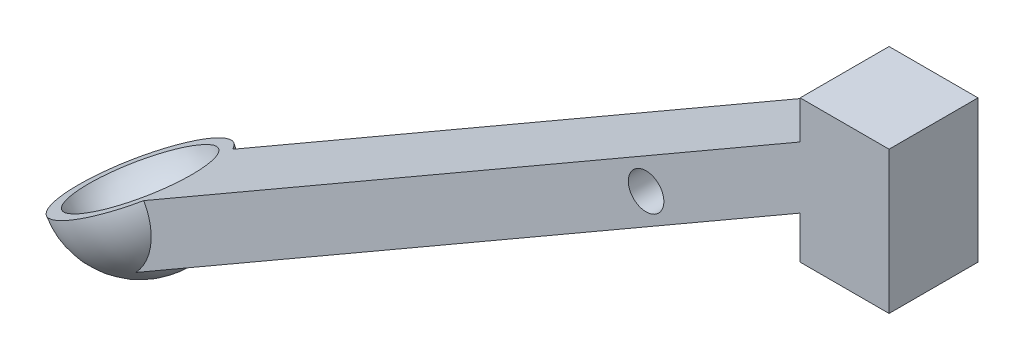
ISO-10303-21;
HEADER;
FILE_DESCRIPTION(('STEP AP214'),'2;1');
FILE_NAME('part.step','',(''),(''),'','','');
FILE_SCHEMA(('AUTOMOTIVE_DESIGN { 1 0 10303 214 1 1 1 1 }'));
ENDSEC;
DATA;
#1=APPLICATION_CONTEXT('core data for automotive mechanical design processes');
#2=APPLICATION_PROTOCOL_DEFINITION('international standard','automotive_design',2000,#1);
#3=PRODUCT_CONTEXT('',#1,'mechanical');
#4=PRODUCT('Part','Part','',(#3));
#5=PRODUCT_RELATED_PRODUCT_CATEGORY('part','',(#4));
#6=PRODUCT_DEFINITION_FORMATION('','',#4);
#7=PRODUCT_DEFINITION_CONTEXT('part definition',#1,'design');
#8=PRODUCT_DEFINITION('design','',#6,#7);
#9=PRODUCT_DEFINITION_SHAPE('','',#8);
#10=(LENGTH_UNIT() NAMED_UNIT(*) SI_UNIT(.MILLI.,.METRE.));
#11=(NAMED_UNIT(*) PLANE_ANGLE_UNIT() SI_UNIT($,.RADIAN.));
#12=(NAMED_UNIT(*) SI_UNIT($,.STERADIAN.) SOLID_ANGLE_UNIT());
#13=UNCERTAINTY_MEASURE_WITH_UNIT(LENGTH_MEASURE(1.E-05),#10,'distance_accuracy_value','');
#14=(GEOMETRIC_REPRESENTATION_CONTEXT(3) GLOBAL_UNCERTAINTY_ASSIGNED_CONTEXT((#13)) GLOBAL_UNIT_ASSIGNED_CONTEXT((#10,
#11,#12)) REPRESENTATION_CONTEXT('',''));
#15=CARTESIAN_POINT('',(0.,0.,0.));
#16=DIRECTION('',(0.,0.,1.));
#17=DIRECTION('',(1.,0.,0.));
#18=AXIS2_PLACEMENT_3D('',#15,#16,#17);
#19=CARTESIAN_POINT('',(25.,-40.,50.));
#20=DIRECTION('',(-1.,0.,0.));
#21=DIRECTION('',(0.,0.,1.));
#22=AXIS2_PLACEMENT_3D('',#19,#20,#21);
#23=PLANE('',#22);
#24=DIRECTION('',(0.,1.,0.));
#25=VECTOR('',#24,1.);
#26=CARTESIAN_POINT('',(25.,-40.,0.));
#27=LINE('',#26,#25);
#28=CARTESIAN_POINT('',(25.,-40.,0.));
#29=VERTEX_POINT('',#28);
#30=CARTESIAN_POINT('',(25.,40.,0.));
#31=VERTEX_POINT('',#30);
#32=EDGE_CURVE('E126',#29,#31,#27,.T.);
#33=ORIENTED_EDGE('',*,*,#32,.T.);
#34=DIRECTION('',(0.,0.,-1.));
#35=VECTOR('',#34,1.);
#36=CARTESIAN_POINT('',(25.,40.,50.));
#37=LINE('',#36,#35);
#38=CARTESIAN_POINT('',(25.,40.,50.));
#39=VERTEX_POINT('',#38);
#40=EDGE_CURVE('E43',#39,#31,#37,.T.);
#41=ORIENTED_EDGE('',*,*,#40,.F.);
#42=DIRECTION('',(0.,1.,0.));
#43=VECTOR('',#42,1.);
#44=CARTESIAN_POINT('',(25.,-40.,50.));
#45=LINE('',#44,#43);
#46=CARTESIAN_POINT('',(25.,-40.,50.));
#47=VERTEX_POINT('',#46);
#48=EDGE_CURVE('E139',#47,#39,#45,.T.);
#49=ORIENTED_EDGE('',*,*,#48,.F.);
#50=DIRECTION('',(0.,0.,-1.));
#51=VECTOR('',#50,1.);
#52=CARTESIAN_POINT('',(25.,-40.,50.));
#53=LINE('',#52,#51);
#54=EDGE_CURVE('E122',#47,#29,#53,.T.);
#55=ORIENTED_EDGE('',*,*,#54,.T.);
#56=EDGE_LOOP('',(#33,#41,#49,#55));
#57=FACE_BOUND('',#56,.T.);
#58=ADVANCED_FACE('F34',(#57),#23,.F.);
#59=CARTESIAN_POINT('',(-25.,40.,50.));
#60=DIRECTION('',(0.,-1.,0.));
#61=DIRECTION('',(0.,0.,-1.));
#62=AXIS2_PLACEMENT_3D('',#59,#60,#61);
#63=PLANE('',#62);
#64=DIRECTION('',(-1.,0.,0.));
#65=VECTOR('',#64,1.);
#66=CARTESIAN_POINT('',(-25.,40.,0.));
#67=LINE('',#66,#65);
#68=CARTESIAN_POINT('',(-25.,40.,0.));
#69=VERTEX_POINT('',#68);
#70=EDGE_CURVE('E129',#31,#69,#67,.T.);
#71=ORIENTED_EDGE('',*,*,#70,.T.);
#72=DIRECTION('',(0.,0.,-1.));
#73=VECTOR('',#72,1.);
#74=CARTESIAN_POINT('',(-25.,40.,50.));
#75=LINE('',#74,#73);
#76=CARTESIAN_POINT('',(-25.,40.,50.));
#77=VERTEX_POINT('',#76);
#78=EDGE_CURVE('E144',#77,#69,#75,.T.);
#79=ORIENTED_EDGE('',*,*,#78,.F.);
#80=DIRECTION('',(-1.,0.,0.));
#81=VECTOR('',#80,1.);
#82=CARTESIAN_POINT('',(-25.,40.,50.));
#83=LINE('',#82,#81);
#84=EDGE_CURVE('E91',#39,#77,#83,.T.);
#85=ORIENTED_EDGE('',*,*,#84,.F.);
#86=ORIENTED_EDGE('',*,*,#40,.T.);
#87=EDGE_LOOP('',(#71,#79,#85,#86));
#88=FACE_BOUND('',#87,.T.);
#89=ADVANCED_FACE('F204',(#88),#63,.F.);
#90=CARTESIAN_POINT('',(-25.,18.5130161513777,50.));
#91=DIRECTION('',(1.,0.,0.));
#92=DIRECTION('',(0.,1.,0.));
#93=AXIS2_PLACEMENT_3D('',#90,#91,#92);
#94=PLANE('',#93);
#95=DIRECTION('',(0.,-1.,0.));
#96=VECTOR('',#95,1.);
#97=CARTESIAN_POINT('',(-25.,18.5130161513777,0.));
#98=LINE('',#97,#96);
#99=CARTESIAN_POINT('',(-25.,18.5130161513777,0.));
#100=VERTEX_POINT('',#99);
#101=EDGE_CURVE('E131',#69,#100,#98,.T.);
#102=ORIENTED_EDGE('',*,*,#101,.T.);
#103=DIRECTION('',(0.,0.,-1.));
#104=VECTOR('',#103,1.);
#105=CARTESIAN_POINT('',(-25.,18.5130161513777,50.));
#106=LINE('',#105,#104);
#107=CARTESIAN_POINT('',(-25.,18.5130161513777,50.));
#108=VERTEX_POINT('',#107);
#109=EDGE_CURVE('E117',#108,#100,#106,.T.);
#110=ORIENTED_EDGE('',*,*,#109,.F.);
#111=DIRECTION('',(0.,-1.,0.));
#112=VECTOR('',#111,1.);
#113=CARTESIAN_POINT('',(-25.,18.5130161513777,50.));
#114=LINE('',#113,#112);
#115=EDGE_CURVE('E168',#77,#108,#114,.T.);
#116=ORIENTED_EDGE('',*,*,#115,.F.);
#117=ORIENTED_EDGE('',*,*,#78,.T.);
#118=EDGE_LOOP('',(#102,#110,#116,#117));
#119=FACE_BOUND('',#118,.T.);
#120=ADVANCED_FACE('F208',(#119),#94,.F.);
#121=CARTESIAN_POINT('',(-25.,18.5130161513777,50.));
#122=DIRECTION('',(0.500000000000004,-0.866025403784436,0.));
#123=DIRECTION('',(0.866025403784436,0.500000000000004,0.));
#124=AXIS2_PLACEMENT_3D('',#121,#122,#123);
#125=PLANE('',#124);
#126=CARTESIAN_POINT('',(-421.016976655454,-210.127491924313,25.));
#127=DIRECTION('',(0.500000000000004,-0.866025403784436,0.));
#128=DIRECTION('',(0.866025403784436,0.500000000000004,0.));
#129=AXIS2_PLACEMENT_3D('',#126,#127,#128);
#130=CIRCLE('',#129,33.5410196624962);
#131=CARTESIAN_POINT('',(-391.969601558899,-193.356982093065,25.));
#132=VERTEX_POINT('',#131);
#133=EDGE_CURVE('E147',#132,#132,#130,.F.);
#134=ORIENTED_EDGE('',*,*,#133,.F.);
#135=EDGE_LOOP('',(#134));
#136=FACE_BOUND('',#135,.T.);
#137=DIRECTION('',(-0.866025403784436,-0.500000000000004,0.));
#138=VECTOR('',#137,1.);
#139=CARTESIAN_POINT('',(-25.,18.5130161513777,0.));
#140=LINE('',#139,#138);
#141=CARTESIAN_POINT('',(-394.009543099172,-194.53474289047,0.));
#142=VERTEX_POINT('',#141);
#143=EDGE_CURVE('E133',#100,#142,#140,.T.);
#144=ORIENTED_EDGE('',*,*,#143,.T.);
#145=CARTESIAN_POINT('',(-421.051177665153,-210.147237886467,24.9999999999978));
#146=DIRECTION('',(0.5,-0.866025403784439,0.));
#147=DIRECTION('',(0.75,0.433012701892221,-0.5));
#148=AXIS2_PLACEMENT_3D('',#145,#146,#147);
#149=CIRCLE('',#148,40.);
#150=CARTESIAN_POINT('',(-394.009543099175,-194.534742890472,50.));
#151=VERTEX_POINT('',#150);
#152=EDGE_CURVE('E149',#151,#142,#149,.T.);
#153=ORIENTED_EDGE('',*,*,#152,.F.);
#154=DIRECTION('',(-0.866025403784436,-0.500000000000004,0.));
#155=VECTOR('',#154,1.);
#156=CARTESIAN_POINT('',(-25.,18.5130161513777,50.));
#157=LINE('',#156,#155);
#158=EDGE_CURVE('E111',#108,#151,#157,.T.);
#159=ORIENTED_EDGE('',*,*,#158,.F.);
#160=ORIENTED_EDGE('',*,*,#109,.T.);
#161=EDGE_LOOP('',(#144,#153,#159,#160));
#162=FACE_BOUND('',#161,.T.);
#163=ADVANCED_FACE('F177',(#136,#162),#125,.F.);
#164=CARTESIAN_POINT('',(-25.,-16.128,50.));
#165=DIRECTION('',(-0.500000000000004,0.866025403784436,0.));
#166=DIRECTION('',(-0.866025403784436,-0.500000000000004,0.));
#167=AXIS2_PLACEMENT_3D('',#164,#165,#166);
#168=PLANE('',#167);
#169=DIRECTION('',(0.866025403784436,0.500000000000004,0.));
#170=VECTOR('',#169,1.);
#171=CARTESIAN_POINT('',(-25.,-16.128,50.));
#172=LINE('',#171,#170);
#173=CARTESIAN_POINT('',(-398.551177665164,-231.797872981087,50.));
#174=VERTEX_POINT('',#173);
#175=CARTESIAN_POINT('',(-25.,-16.128,50.));
#176=VERTEX_POINT('',#175);
#177=EDGE_CURVE('E101',#174,#176,#172,.T.);
#178=ORIENTED_EDGE('',*,*,#177,.F.);
#179=CARTESIAN_POINT('',(-406.051177665152,-236.128000000002,24.9999999999978));
#180=DIRECTION('',(-0.500000000000004,0.866025403784436,0.));
#181=DIRECTION('',(-0.866025403784436,-0.500000000000004,0.));
#182=AXIS2_PLACEMENT_3D('',#179,#180,#181);
#183=CIRCLE('',#182,26.4575131106434);
#184=CARTESIAN_POINT('',(-398.551177665153,-231.79787298108,0.));
#185=VERTEX_POINT('',#184);
#186=EDGE_CURVE('E153',#174,#185,#183,.T.);
#187=ORIENTED_EDGE('',*,*,#186,.T.);
#188=DIRECTION('',(0.866025403784436,0.500000000000004,0.));
#189=VECTOR('',#188,1.);
#190=CARTESIAN_POINT('',(-25.,-16.128,0.));
#191=LINE('',#190,#189);
#192=CARTESIAN_POINT('',(-25.,-16.128,0.));
#193=VERTEX_POINT('',#192);
#194=EDGE_CURVE('E116',#185,#193,#191,.T.);
#195=ORIENTED_EDGE('',*,*,#194,.T.);
#196=DIRECTION('',(0.,0.,-1.));
#197=VECTOR('',#196,1.);
#198=CARTESIAN_POINT('',(-25.,-16.128,50.));
#199=LINE('',#198,#197);
#200=EDGE_CURVE('E113',#176,#193,#199,.T.);
#201=ORIENTED_EDGE('',*,*,#200,.F.);
#202=EDGE_LOOP('',(#178,#187,#195,#201));
#203=FACE_BOUND('',#202,.T.);
#204=ADVANCED_FACE('F114',(#203),#168,.F.);
#205=CARTESIAN_POINT('',(-25.,-40.,50.));
#206=DIRECTION('',(1.,0.,0.));
#207=DIRECTION('',(0.,0.,-1.));
#208=AXIS2_PLACEMENT_3D('',#205,#206,#207);
#209=PLANE('',#208);
#210=DIRECTION('',(0.,-1.,0.));
#211=VECTOR('',#210,1.);
#212=CARTESIAN_POINT('',(-25.,-40.,0.));
#213=LINE('',#212,#211);
#214=CARTESIAN_POINT('',(-25.,-40.,0.));
#215=VERTEX_POINT('',#214);
#216=EDGE_CURVE('E76',#193,#215,#213,.T.);
#217=ORIENTED_EDGE('',*,*,#216,.T.);
#218=DIRECTION('',(0.,0.,-1.));
#219=VECTOR('',#218,1.);
#220=CARTESIAN_POINT('',(-25.,-40.,50.));
#221=LINE('',#220,#219);
#222=CARTESIAN_POINT('',(-25.,-40.,50.));
#223=VERTEX_POINT('',#222);
#224=EDGE_CURVE('E118',#223,#215,#221,.T.);
#225=ORIENTED_EDGE('',*,*,#224,.F.);
#226=DIRECTION('',(0.,-1.,0.));
#227=VECTOR('',#226,1.);
#228=CARTESIAN_POINT('',(-25.,-40.,50.));
#229=LINE('',#228,#227);
#230=EDGE_CURVE('E106',#176,#223,#229,.T.);
#231=ORIENTED_EDGE('',*,*,#230,.F.);
#232=ORIENTED_EDGE('',*,*,#200,.T.);
#233=EDGE_LOOP('',(#217,#225,#231,#232));
#234=FACE_BOUND('',#233,.T.);
#235=ADVANCED_FACE('F120',(#234),#209,.F.);
#236=CARTESIAN_POINT('',(-25.,-40.,50.));
#237=DIRECTION('',(0.,1.,0.));
#238=DIRECTION('',(0.,0.,1.));
#239=AXIS2_PLACEMENT_3D('',#236,#237,#238);
#240=PLANE('',#239);
#241=DIRECTION('',(1.,0.,0.));
#242=VECTOR('',#241,1.);
#243=CARTESIAN_POINT('',(-25.,-40.,0.));
#244=LINE('',#243,#242);
#245=EDGE_CURVE('E82',#215,#29,#244,.T.);
#246=ORIENTED_EDGE('',*,*,#245,.T.);
#247=ORIENTED_EDGE('',*,*,#54,.F.);
#248=DIRECTION('',(1.,0.,0.));
#249=VECTOR('',#248,1.);
#250=CARTESIAN_POINT('',(-25.,-40.,50.));
#251=LINE('',#250,#249);
#252=EDGE_CURVE('E52',#223,#47,#251,.T.);
#253=ORIENTED_EDGE('',*,*,#252,.F.);
#254=ORIENTED_EDGE('',*,*,#224,.T.);
#255=EDGE_LOOP('',(#246,#247,#253,#254));
#256=FACE_BOUND('',#255,.T.);
#257=ADVANCED_FACE('F192',(#256),#240,.F.);
#258=CARTESIAN_POINT('',(0.,0.,50.));
#259=DIRECTION('',(0.,0.,-1.));
#260=DIRECTION('',(-1.,0.,0.));
#261=AXIS2_PLACEMENT_3D('',#258,#259,#260);
#262=PLANE('',#261);
#263=CARTESIAN_POINT('',(-111.602540378444,-48.8074919243112,50.));
#264=DIRECTION('',(0.,0.,1.));
#265=DIRECTION('',(1.,0.,0.));
#266=AXIS2_PLACEMENT_3D('',#263,#264,#265);
#267=CIRCLE('',#266,10.);
#268=CARTESIAN_POINT('',(-101.602540378444,-48.8074919243112,50.));
#269=VERTEX_POINT('',#268);
#270=EDGE_CURVE('E156',#269,#269,#267,.T.);
#271=ORIENTED_EDGE('',*,*,#270,.F.);
#272=EDGE_LOOP('',(#271));
#273=FACE_BOUND('',#272,.T.);
#274=ORIENTED_EDGE('',*,*,#158,.T.);
#275=CARTESIAN_POINT('',(-421.051177665153,-210.147237886467,50.));
#276=DIRECTION('',(0.,0.,-1.));
#277=DIRECTION('',(-1.,0.,0.));
#278=AXIS2_PLACEMENT_3D('',#275,#276,#277);
#279=CIRCLE('',#278,31.2249899919902);
#280=EDGE_CURVE('E108',#151,#174,#279,.T.);
#281=ORIENTED_EDGE('',*,*,#280,.T.);
#282=ORIENTED_EDGE('',*,*,#177,.T.);
#283=ORIENTED_EDGE('',*,*,#230,.T.);
#284=ORIENTED_EDGE('',*,*,#252,.T.);
#285=ORIENTED_EDGE('',*,*,#48,.T.);
#286=ORIENTED_EDGE('',*,*,#84,.T.);
#287=ORIENTED_EDGE('',*,*,#115,.T.);
#288=EDGE_LOOP('',(#274,#281,#282,#283,#284,#285,#286,#287));
#289=FACE_BOUND('',#288,.T.);
#290=ADVANCED_FACE('F104',(#273,#289),#262,.F.);
#291=CARTESIAN_POINT('',(0.,0.,0.));
#292=DIRECTION('',(0.,0.,-1.));
#293=DIRECTION('',(-1.,0.,0.));
#294=AXIS2_PLACEMENT_3D('',#291,#292,#293);
#295=PLANE('',#294);
#296=CARTESIAN_POINT('',(-111.602540378444,-48.8074919243112,0.));
#297=DIRECTION('',(0.,0.,-1.));
#298=DIRECTION('',(-1.,0.,0.));
#299=AXIS2_PLACEMENT_3D('',#296,#297,#298);
#300=CIRCLE('',#299,10.);
#301=CARTESIAN_POINT('',(-121.602540378444,-48.8074919243112,0.));
#302=VERTEX_POINT('',#301);
#303=EDGE_CURVE('E37',#302,#302,#300,.T.);
#304=ORIENTED_EDGE('',*,*,#303,.F.);
#305=EDGE_LOOP('',(#304));
#306=FACE_BOUND('',#305,.T.);
#307=CARTESIAN_POINT('',(-421.051177665153,-210.147237886467,0.));
#308=DIRECTION('',(0.,0.,-1.));
#309=DIRECTION('',(-1.,0.,0.));
#310=AXIS2_PLACEMENT_3D('',#307,#308,#309);
#311=CIRCLE('',#310,31.2249899919938);
#312=EDGE_CURVE('E11',#142,#185,#311,.T.);
#313=ORIENTED_EDGE('',*,*,#312,.F.);
#314=ORIENTED_EDGE('',*,*,#143,.F.);
#315=ORIENTED_EDGE('',*,*,#101,.F.);
#316=ORIENTED_EDGE('',*,*,#70,.F.);
#317=ORIENTED_EDGE('',*,*,#32,.F.);
#318=ORIENTED_EDGE('',*,*,#245,.F.);
#319=ORIENTED_EDGE('',*,*,#216,.F.);
#320=ORIENTED_EDGE('',*,*,#194,.F.);
#321=EDGE_LOOP('',(#313,#314,#315,#316,#317,#318,#319,#320));
#322=FACE_BOUND('',#321,.T.);
#323=ADVANCED_FACE('F186',(#306,#322),#295,.T.);
#324=CARTESIAN_POINT('',(-421.051177665153,-210.147237886467,24.9999999999978));
#325=DIRECTION('',(-0.866025403784438,-0.5,0.));
#326=DIRECTION('',(0.,0.,1.));
#327=AXIS2_PLACEMENT_3D('',#324,#325,#326);
#328=SPHERICAL_SURFACE('',#327,40.);
#329=ORIENTED_EDGE('',*,*,#280,.F.);
#330=ORIENTED_EDGE('',*,*,#152,.T.);
#331=ORIENTED_EDGE('',*,*,#312,.T.);
#332=ORIENTED_EDGE('',*,*,#186,.F.);
#333=EDGE_LOOP('',(#329,#330,#331,#332));
#334=FACE_BOUND('',#333,.T.);
#335=ADVANCED_FACE('F181',(#334),#328,.T.);
#336=CARTESIAN_POINT('',(-426.016976655455,-201.467237886467,25.));
#337=DIRECTION('',(0.866025403784439,0.5,0.));
#338=DIRECTION('',(0.,0.,1.));
#339=AXIS2_PLACEMENT_3D('',#336,#337,#338);
#340=SPHERICAL_SURFACE('',#339,35.);
#341=CARTESIAN_POINT('',(-426.016976655455,-201.467237886467,25.));
#342=DIRECTION('',(0.500000000000004,-0.866025403784436,0.));
#343=DIRECTION('',(0.866025403784436,0.500000000000004,0.));
#344=AXIS2_PLACEMENT_3D('',#341,#342,#343);
#345=SPHERICAL_SURFACE('',#344,35.);
#346=ORIENTED_EDGE('',*,*,#133,.T.);
#347=EDGE_LOOP('',(#346));
#348=FACE_BOUND('',#347,.T.);
#349=ADVANCED_FACE('F268',(#348),#345,.F.);
#350=CARTESIAN_POINT('',(-111.602540378444,-48.8074919243112,-15.0000000000023));
#351=DIRECTION('',(0.,0.,1.));
#352=DIRECTION('',(1.,0.,0.));
#353=AXIS2_PLACEMENT_3D('',#350,#351,#352);
#354=CYLINDRICAL_SURFACE('',#353,10.);
#355=ORIENTED_EDGE('',*,*,#303,.T.);
#356=EDGE_LOOP('',(#355));
#357=FACE_BOUND('',#356,.T.);
#358=ORIENTED_EDGE('',*,*,#270,.T.);
#359=EDGE_LOOP('',(#358));
#360=FACE_BOUND('',#359,.T.);
#361=ADVANCED_FACE('F275',(#357,#360),#354,.F.);
#362=CLOSED_SHELL('',(#58,#89,#120,#163,#204,#235,#257,#290,#323,#335,#349,#361));
#363=MANIFOLD_SOLID_BREP('B2',#362);
#364=ADVANCED_BREP_SHAPE_REPRESENTATION('',(#18,#363),#14);
#365=SHAPE_DEFINITION_REPRESENTATION(#9,#364);
ENDSEC;
END-ISO-10303-21;
